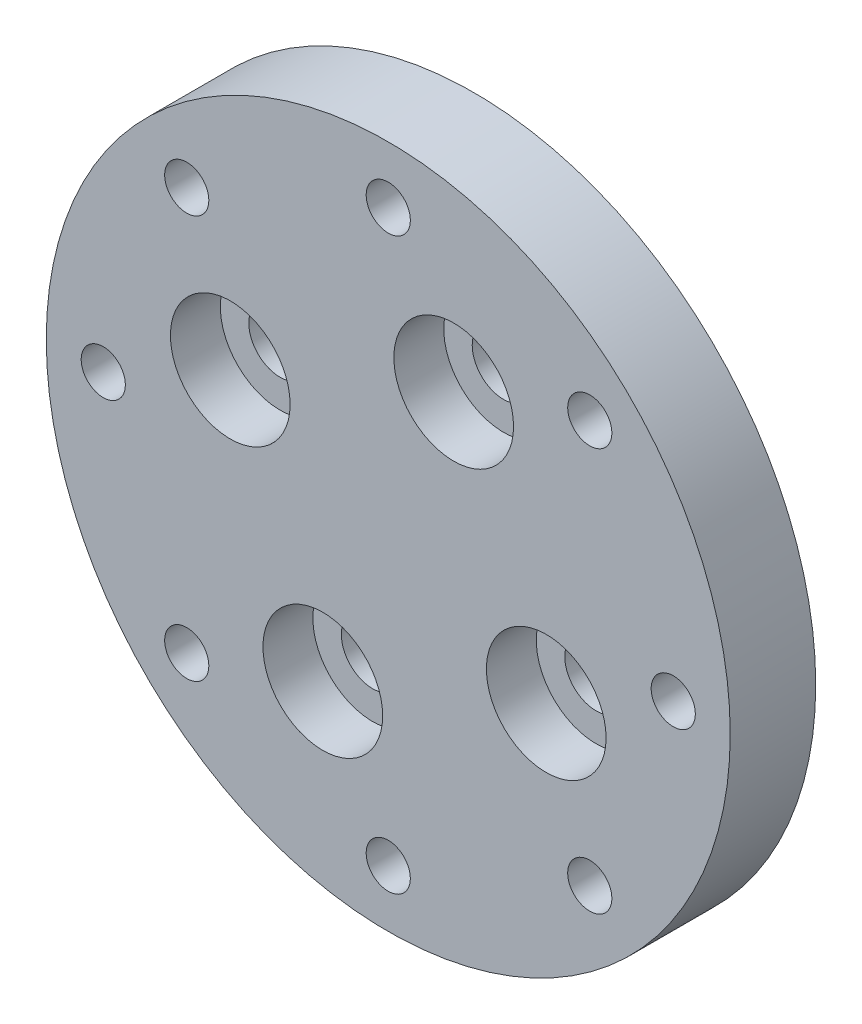
ISO-10303-21;
HEADER;
FILE_DESCRIPTION(('STEP AP214'),'2;1');
FILE_NAME('part.step','',(''),(''),'','','');
FILE_SCHEMA(('AUTOMOTIVE_DESIGN { 1 0 10303 214 1 1 1 1 }'));
ENDSEC;
DATA;
#1=APPLICATION_CONTEXT('core data for automotive mechanical design processes');
#2=APPLICATION_PROTOCOL_DEFINITION('international standard','automotive_design',2000,#1);
#3=PRODUCT_CONTEXT('',#1,'mechanical');
#4=PRODUCT('Part','Part','',(#3));
#5=PRODUCT_RELATED_PRODUCT_CATEGORY('part','',(#4));
#6=PRODUCT_DEFINITION_FORMATION('','',#4);
#7=PRODUCT_DEFINITION_CONTEXT('part definition',#1,'design');
#8=PRODUCT_DEFINITION('design','',#6,#7);
#9=PRODUCT_DEFINITION_SHAPE('','',#8);
#10=(LENGTH_UNIT() NAMED_UNIT(*) SI_UNIT(.MILLI.,.METRE.));
#11=(NAMED_UNIT(*) PLANE_ANGLE_UNIT() SI_UNIT($,.RADIAN.));
#12=(NAMED_UNIT(*) SI_UNIT($,.STERADIAN.) SOLID_ANGLE_UNIT());
#13=UNCERTAINTY_MEASURE_WITH_UNIT(LENGTH_MEASURE(1.E-05),#10,'distance_accuracy_value','');
#14=(GEOMETRIC_REPRESENTATION_CONTEXT(3) GLOBAL_UNCERTAINTY_ASSIGNED_CONTEXT((#13)) GLOBAL_UNIT_ASSIGNED_CONTEXT((#10,
#11,#12)) REPRESENTATION_CONTEXT('',''));
#15=CARTESIAN_POINT('',(0.,0.,0.));
#16=DIRECTION('',(0.,0.,1.));
#17=DIRECTION('',(1.,0.,0.));
#18=AXIS2_PLACEMENT_3D('',#15,#16,#17);
#19=CARTESIAN_POINT('',(0.,20.,12.2225396744427));
#20=DIRECTION('',(0.,0.,-1.));
#21=DIRECTION('',(-1.,0.,0.));
#22=AXIS2_PLACEMENT_3D('',#19,#20,#21);
#23=CYLINDRICAL_SURFACE('',#22,1.55);
#24=CARTESIAN_POINT('',(0.,20.,6.));
#25=DIRECTION('',(0.,0.,1.));
#26=DIRECTION('',(1.,0.,0.));
#27=AXIS2_PLACEMENT_3D('',#24,#25,#26);
#28=CIRCLE('',#27,1.55);
#29=CARTESIAN_POINT('',(1.55,20.,6.));
#30=VERTEX_POINT('',#29);
#31=EDGE_CURVE('E129',#30,#30,#28,.F.);
#32=ORIENTED_EDGE('',*,*,#31,.F.);
#33=EDGE_LOOP('',(#32));
#34=FACE_BOUND('',#33,.T.);
#35=CARTESIAN_POINT('',(0.,20.,3.));
#36=DIRECTION('',(0.,0.,-1.));
#37=DIRECTION('',(-1.,0.,0.));
#38=AXIS2_PLACEMENT_3D('',#35,#36,#37);
#39=CIRCLE('',#38,1.55);
#40=CARTESIAN_POINT('',(-1.55,20.,3.));
#41=VERTEX_POINT('',#40);
#42=EDGE_CURVE('E38',#41,#41,#39,.F.);
#43=ORIENTED_EDGE('',*,*,#42,.F.);
#44=EDGE_LOOP('',(#43));
#45=FACE_BOUND('',#44,.T.);
#46=ADVANCED_FACE('F34',(#34,#45),#23,.F.);
#47=CARTESIAN_POINT('',(-14.1421356237312,14.1421356237316,12.2225396744427));
#48=DIRECTION('',(0.,0.,-1.));
#49=DIRECTION('',(-1.,0.,0.));
#50=AXIS2_PLACEMENT_3D('',#47,#48,#49);
#51=CYLINDRICAL_SURFACE('',#50,1.5500000000001);
#52=CARTESIAN_POINT('',(-14.1421356237312,14.1421356237316,6.));
#53=DIRECTION('',(0.,0.,1.));
#54=DIRECTION('',(1.,0.,0.));
#55=AXIS2_PLACEMENT_3D('',#52,#53,#54);
#56=CIRCLE('',#55,1.5500000000001);
#57=CARTESIAN_POINT('',(-12.5921356237311,14.1421356237316,6.));
#58=VERTEX_POINT('',#57);
#59=EDGE_CURVE('E132',#58,#58,#56,.F.);
#60=ORIENTED_EDGE('',*,*,#59,.F.);
#61=EDGE_LOOP('',(#60));
#62=FACE_BOUND('',#61,.T.);
#63=CARTESIAN_POINT('',(-14.1421356237312,14.1421356237316,3.));
#64=DIRECTION('',(0.,0.,-1.));
#65=DIRECTION('',(-1.,0.,0.));
#66=AXIS2_PLACEMENT_3D('',#63,#64,#65);
#67=CIRCLE('',#66,1.5500000000001);
#68=CARTESIAN_POINT('',(-15.6921356237313,14.1421356237316,3.));
#69=VERTEX_POINT('',#68);
#70=EDGE_CURVE('E84',#69,#69,#67,.F.);
#71=ORIENTED_EDGE('',*,*,#70,.F.);
#72=EDGE_LOOP('',(#71));
#73=FACE_BOUND('',#72,.T.);
#74=ADVANCED_FACE('F170',(#62,#73),#51,.F.);
#75=CARTESIAN_POINT('',(-20.0000000000008,8.50201989313825E-13,12.2225396744427));
#76=DIRECTION('',(0.,0.,-1.));
#77=DIRECTION('',(-1.,0.,0.));
#78=AXIS2_PLACEMENT_3D('',#75,#76,#77);
#79=CYLINDRICAL_SURFACE('',#78,1.55000000000063);
#80=CARTESIAN_POINT('',(-20.0000000000008,8.50201989313825E-13,6.));
#81=DIRECTION('',(0.,0.,1.));
#82=DIRECTION('',(1.,0.,0.));
#83=AXIS2_PLACEMENT_3D('',#80,#81,#82);
#84=CIRCLE('',#83,1.55000000000063);
#85=CARTESIAN_POINT('',(-18.4500000000002,8.50201989313825E-13,6.));
#86=VERTEX_POINT('',#85);
#87=EDGE_CURVE('E135',#86,#86,#84,.F.);
#88=ORIENTED_EDGE('',*,*,#87,.F.);
#89=EDGE_LOOP('',(#88));
#90=FACE_BOUND('',#89,.T.);
#91=CARTESIAN_POINT('',(-20.0000000000008,8.50201989313825E-13,3.));
#92=DIRECTION('',(0.,0.,-1.));
#93=DIRECTION('',(-1.,0.,0.));
#94=AXIS2_PLACEMENT_3D('',#91,#92,#93);
#95=CIRCLE('',#94,1.55000000000063);
#96=CARTESIAN_POINT('',(-21.5500000000015,8.50201989313825E-13,3.));
#97=VERTEX_POINT('',#96);
#98=EDGE_CURVE('E82',#97,#97,#95,.F.);
#99=ORIENTED_EDGE('',*,*,#98,.F.);
#100=EDGE_LOOP('',(#99));
#101=FACE_BOUND('',#100,.T.);
#102=ADVANCED_FACE('F147',(#90,#101),#79,.F.);
#103=CARTESIAN_POINT('',(-14.1421356237324,-14.1421356237303,12.2225396744427));
#104=DIRECTION('',(0.,0.,-1.));
#105=DIRECTION('',(-1.,0.,0.));
#106=AXIS2_PLACEMENT_3D('',#103,#104,#105);
#107=CYLINDRICAL_SURFACE('',#106,1.55000000000131);
#108=CARTESIAN_POINT('',(-14.1421356237324,-14.1421356237303,6.));
#109=DIRECTION('',(0.,0.,1.));
#110=DIRECTION('',(1.,0.,0.));
#111=AXIS2_PLACEMENT_3D('',#108,#109,#110);
#112=CIRCLE('',#111,1.55000000000131);
#113=CARTESIAN_POINT('',(-12.5921356237311,-14.1421356237303,6.));
#114=VERTEX_POINT('',#113);
#115=EDGE_CURVE('E120',#114,#114,#112,.F.);
#116=ORIENTED_EDGE('',*,*,#115,.F.);
#117=EDGE_LOOP('',(#116));
#118=FACE_BOUND('',#117,.T.);
#119=CARTESIAN_POINT('',(-14.1421356237324,-14.1421356237303,3.));
#120=DIRECTION('',(0.,0.,-1.));
#121=DIRECTION('',(-1.,0.,0.));
#122=AXIS2_PLACEMENT_3D('',#119,#120,#121);
#123=CIRCLE('',#122,1.55000000000131);
#124=CARTESIAN_POINT('',(-15.6921356237337,-14.1421356237303,3.));
#125=VERTEX_POINT('',#124);
#126=EDGE_CURVE('E79',#125,#125,#123,.F.);
#127=ORIENTED_EDGE('',*,*,#126,.F.);
#128=EDGE_LOOP('',(#127));
#129=FACE_BOUND('',#128,.T.);
#130=ADVANCED_FACE('F143',(#118,#129),#107,.F.);
#131=CARTESIAN_POINT('',(-1.70040397862765E-12,-20.,12.2225396744427));
#132=DIRECTION('',(0.,0.,-1.));
#133=DIRECTION('',(-1.,0.,0.));
#134=AXIS2_PLACEMENT_3D('',#131,#132,#133);
#135=CYLINDRICAL_SURFACE('',#134,1.55000000000176);
#136=CARTESIAN_POINT('',(-1.70040397862765E-12,-20.,6.));
#137=DIRECTION('',(0.,0.,1.));
#138=DIRECTION('',(1.,0.,0.));
#139=AXIS2_PLACEMENT_3D('',#136,#137,#138);
#140=CIRCLE('',#139,1.55000000000176);
#141=CARTESIAN_POINT('',(1.55000000000006,-20.,6.));
#142=VERTEX_POINT('',#141);
#143=EDGE_CURVE('E117',#142,#142,#140,.F.);
#144=ORIENTED_EDGE('',*,*,#143,.F.);
#145=EDGE_LOOP('',(#144));
#146=FACE_BOUND('',#145,.T.);
#147=CARTESIAN_POINT('',(-1.70040397862765E-12,-20.,3.));
#148=DIRECTION('',(0.,0.,-1.));
#149=DIRECTION('',(-1.,0.,0.));
#150=AXIS2_PLACEMENT_3D('',#147,#148,#149);
#151=CIRCLE('',#150,1.55000000000176);
#152=CARTESIAN_POINT('',(-1.55000000000346,-20.,3.));
#153=VERTEX_POINT('',#152);
#154=EDGE_CURVE('E76',#153,#153,#151,.F.);
#155=ORIENTED_EDGE('',*,*,#154,.F.);
#156=EDGE_LOOP('',(#155));
#157=FACE_BOUND('',#156,.T.);
#158=ADVANCED_FACE('F146',(#146,#157),#135,.F.);
#159=CARTESIAN_POINT('',(14.1421356237295,-14.1421356237316,12.2225396744427));
#160=DIRECTION('',(0.,0.,-1.));
#161=DIRECTION('',(-1.,0.,0.));
#162=AXIS2_PLACEMENT_3D('',#159,#160,#161);
#163=CYLINDRICAL_SURFACE('',#162,1.55000000000173);
#164=CARTESIAN_POINT('',(14.1421356237295,-14.1421356237316,6.));
#165=DIRECTION('',(0.,0.,1.));
#166=DIRECTION('',(1.,0.,0.));
#167=AXIS2_PLACEMENT_3D('',#164,#165,#166);
#168=CIRCLE('',#167,1.55000000000173);
#169=CARTESIAN_POINT('',(15.6921356237312,-14.1421356237316,6.));
#170=VERTEX_POINT('',#169);
#171=EDGE_CURVE('E121',#170,#170,#168,.F.);
#172=ORIENTED_EDGE('',*,*,#171,.F.);
#173=EDGE_LOOP('',(#172));
#174=FACE_BOUND('',#173,.T.);
#175=CARTESIAN_POINT('',(14.1421356237295,-14.1421356237316,3.));
#176=DIRECTION('',(0.,0.,-1.));
#177=DIRECTION('',(-1.,0.,0.));
#178=AXIS2_PLACEMENT_3D('',#175,#176,#177);
#179=CIRCLE('',#178,1.55000000000173);
#180=CARTESIAN_POINT('',(12.5921356237278,-14.1421356237316,3.));
#181=VERTEX_POINT('',#180);
#182=EDGE_CURVE('E73',#181,#181,#179,.F.);
#183=ORIENTED_EDGE('',*,*,#182,.F.);
#184=EDGE_LOOP('',(#183));
#185=FACE_BOUND('',#184,.T.);
#186=ADVANCED_FACE('F271',(#174,#185),#163,.F.);
#187=CARTESIAN_POINT('',(19.9999999999992,-8.5265128291212E-13,12.2225396744427));
#188=DIRECTION('',(0.,0.,-1.));
#189=DIRECTION('',(-1.,0.,0.));
#190=AXIS2_PLACEMENT_3D('',#187,#188,#189);
#191=CYLINDRICAL_SURFACE('',#190,1.55000000000126);
#192=CARTESIAN_POINT('',(19.9999999999992,-8.5265128291212E-13,6.));
#193=DIRECTION('',(0.,0.,1.));
#194=DIRECTION('',(1.,0.,0.));
#195=AXIS2_PLACEMENT_3D('',#192,#193,#194);
#196=CIRCLE('',#195,1.55000000000126);
#197=CARTESIAN_POINT('',(21.5500000000004,-8.5265128291212E-13,6.));
#198=VERTEX_POINT('',#197);
#199=EDGE_CURVE('E124',#198,#198,#196,.F.);
#200=ORIENTED_EDGE('',*,*,#199,.F.);
#201=EDGE_LOOP('',(#200));
#202=FACE_BOUND('',#201,.T.);
#203=CARTESIAN_POINT('',(19.9999999999992,-8.5265128291212E-13,3.));
#204=DIRECTION('',(0.,0.,-1.));
#205=DIRECTION('',(-1.,0.,0.));
#206=AXIS2_PLACEMENT_3D('',#203,#204,#205);
#207=CIRCLE('',#206,1.55000000000126);
#208=CARTESIAN_POINT('',(18.4499999999979,-8.5265128291212E-13,3.));
#209=VERTEX_POINT('',#208);
#210=EDGE_CURVE('E69',#209,#209,#207,.F.);
#211=ORIENTED_EDGE('',*,*,#210,.F.);
#212=EDGE_LOOP('',(#211));
#213=FACE_BOUND('',#212,.T.);
#214=ADVANCED_FACE('F274',(#202,#213),#191,.F.);
#215=CARTESIAN_POINT('',(14.1421356237307,14.1421356237303,12.2225396744427));
#216=DIRECTION('',(0.,0.,-1.));
#217=DIRECTION('',(-1.,0.,0.));
#218=AXIS2_PLACEMENT_3D('',#215,#216,#217);
#219=CYLINDRICAL_SURFACE('',#218,1.55000000000065);
#220=CARTESIAN_POINT('',(14.1421356237307,14.1421356237303,6.));
#221=DIRECTION('',(0.,0.,1.));
#222=DIRECTION('',(1.,0.,0.));
#223=AXIS2_PLACEMENT_3D('',#220,#221,#222);
#224=CIRCLE('',#223,1.55000000000065);
#225=CARTESIAN_POINT('',(15.6921356237314,14.1421356237303,6.));
#226=VERTEX_POINT('',#225);
#227=EDGE_CURVE('E111',#226,#226,#224,.F.);
#228=ORIENTED_EDGE('',*,*,#227,.F.);
#229=EDGE_LOOP('',(#228));
#230=FACE_BOUND('',#229,.T.);
#231=CARTESIAN_POINT('',(14.1421356237307,14.1421356237303,3.));
#232=DIRECTION('',(0.,0.,-1.));
#233=DIRECTION('',(-1.,0.,0.));
#234=AXIS2_PLACEMENT_3D('',#231,#232,#233);
#235=CIRCLE('',#234,1.55000000000065);
#236=CARTESIAN_POINT('',(12.5921356237301,14.1421356237303,3.));
#237=VERTEX_POINT('',#236);
#238=EDGE_CURVE('E66',#237,#237,#235,.F.);
#239=ORIENTED_EDGE('',*,*,#238,.F.);
#240=EDGE_LOOP('',(#239));
#241=FACE_BOUND('',#240,.T.);
#242=ADVANCED_FACE('F181',(#230,#241),#219,.F.);
#243=CARTESIAN_POINT('',(-11.0865543901354,4.59220118838109,12.2225396744427));
#244=DIRECTION('',(0.,0.,-1.));
#245=DIRECTION('',(-1.,0.,0.));
#246=AXIS2_PLACEMENT_3D('',#243,#244,#245);
#247=CYLINDRICAL_SURFACE('',#246,2.2);
#248=CARTESIAN_POINT('',(-11.0865543901354,4.59220118838109,0.));
#249=DIRECTION('',(0.,0.,-1.));
#250=DIRECTION('',(-1.,0.,0.));
#251=AXIS2_PLACEMENT_3D('',#248,#249,#250);
#252=CIRCLE('',#251,2.2);
#253=CARTESIAN_POINT('',(-13.2865543901354,4.59220118838109,0.));
#254=VERTEX_POINT('',#253);
#255=EDGE_CURVE('E47',#254,#254,#252,.T.);
#256=ORIENTED_EDGE('',*,*,#255,.T.);
#257=EDGE_LOOP('',(#256));
#258=FACE_BOUND('',#257,.T.);
#259=CARTESIAN_POINT('',(-11.0865543901354,4.59220118838109,2.5));
#260=DIRECTION('',(0.,0.,1.));
#261=DIRECTION('',(1.,0.,0.));
#262=AXIS2_PLACEMENT_3D('',#259,#260,#261);
#263=CIRCLE('',#262,2.2);
#264=CARTESIAN_POINT('',(-8.88655439013544,4.59220118838109,2.5));
#265=VERTEX_POINT('',#264);
#266=EDGE_CURVE('E62',#265,#265,#263,.F.);
#267=ORIENTED_EDGE('',*,*,#266,.F.);
#268=EDGE_LOOP('',(#267));
#269=FACE_BOUND('',#268,.T.);
#270=ADVANCED_FACE('F187',(#258,#269),#247,.F.);
#271=CARTESIAN_POINT('',(4.59220118838127,11.086554390135,12.2225396744427));
#272=DIRECTION('',(0.,0.,-1.));
#273=DIRECTION('',(-1.,0.,0.));
#274=AXIS2_PLACEMENT_3D('',#271,#272,#273);
#275=CYLINDRICAL_SURFACE('',#274,2.20000000000037);
#276=CARTESIAN_POINT('',(4.59220118838127,11.086554390135,0.));
#277=DIRECTION('',(0.,0.,-1.));
#278=DIRECTION('',(-1.,0.,0.));
#279=AXIS2_PLACEMENT_3D('',#276,#277,#278);
#280=CIRCLE('',#279,2.20000000000037);
#281=CARTESIAN_POINT('',(2.39220118838089,11.086554390135,0.));
#282=VERTEX_POINT('',#281);
#283=EDGE_CURVE('E65',#282,#282,#280,.T.);
#284=ORIENTED_EDGE('',*,*,#283,.T.);
#285=EDGE_LOOP('',(#284));
#286=FACE_BOUND('',#285,.T.);
#287=CARTESIAN_POINT('',(4.59220118838127,11.086554390135,2.5));
#288=DIRECTION('',(0.,0.,1.));
#289=DIRECTION('',(1.,0.,0.));
#290=AXIS2_PLACEMENT_3D('',#287,#288,#289);
#291=CIRCLE('',#290,2.20000000000037);
#292=CARTESIAN_POINT('',(6.79220118838164,11.086554390135,2.5));
#293=VERTEX_POINT('',#292);
#294=EDGE_CURVE('E59',#293,#293,#291,.F.);
#295=ORIENTED_EDGE('',*,*,#294,.F.);
#296=EDGE_LOOP('',(#295));
#297=FACE_BOUND('',#296,.T.);
#298=ADVANCED_FACE('F190',(#286,#297),#275,.F.);
#299=CARTESIAN_POINT('',(11.0865543901352,-4.5922011883817,12.2225396744427));
#300=DIRECTION('',(0.,0.,-1.));
#301=DIRECTION('',(-1.,0.,0.));
#302=AXIS2_PLACEMENT_3D('',#299,#300,#301);
#303=CYLINDRICAL_SURFACE('',#302,2.20000000000007);
#304=CARTESIAN_POINT('',(11.0865543901352,-4.5922011883817,0.));
#305=DIRECTION('',(0.,0.,-1.));
#306=DIRECTION('',(-1.,0.,0.));
#307=AXIS2_PLACEMENT_3D('',#304,#305,#306);
#308=CIRCLE('',#307,2.20000000000007);
#309=CARTESIAN_POINT('',(8.88655439013512,-4.5922011883817,0.));
#310=VERTEX_POINT('',#309);
#311=EDGE_CURVE('E112',#310,#310,#308,.T.);
#312=ORIENTED_EDGE('',*,*,#311,.T.);
#313=EDGE_LOOP('',(#312));
#314=FACE_BOUND('',#313,.T.);
#315=CARTESIAN_POINT('',(11.0865543901352,-4.5922011883817,2.5));
#316=DIRECTION('',(0.,0.,1.));
#317=DIRECTION('',(1.,0.,0.));
#318=AXIS2_PLACEMENT_3D('',#315,#316,#317);
#319=CIRCLE('',#318,2.20000000000007);
#320=CARTESIAN_POINT('',(13.2865543901353,-4.5922011883817,2.5));
#321=VERTEX_POINT('',#320);
#322=EDGE_CURVE('E55',#321,#321,#319,.F.);
#323=ORIENTED_EDGE('',*,*,#322,.F.);
#324=EDGE_LOOP('',(#323));
#325=FACE_BOUND('',#324,.T.);
#326=ADVANCED_FACE('F253',(#314,#325),#303,.F.);
#327=CARTESIAN_POINT('',(-4.59220118838152,-11.0865543901356,12.2225396744427));
#328=DIRECTION('',(0.,0.,-1.));
#329=DIRECTION('',(-1.,0.,0.));
#330=AXIS2_PLACEMENT_3D('',#327,#328,#329);
#331=CYLINDRICAL_SURFACE('',#330,2.19999999999971);
#332=CARTESIAN_POINT('',(-4.59220118838152,-11.0865543901356,0.));
#333=DIRECTION('',(0.,0.,-1.));
#334=DIRECTION('',(-1.,0.,0.));
#335=AXIS2_PLACEMENT_3D('',#332,#333,#334);
#336=CIRCLE('',#335,2.19999999999971);
#337=CARTESIAN_POINT('',(-6.79220118838123,-11.0865543901356,0.));
#338=VERTEX_POINT('',#337);
#339=EDGE_CURVE('E108',#338,#338,#336,.T.);
#340=ORIENTED_EDGE('',*,*,#339,.T.);
#341=EDGE_LOOP('',(#340));
#342=FACE_BOUND('',#341,.T.);
#343=CARTESIAN_POINT('',(-4.59220118838152,-11.0865543901356,2.5));
#344=DIRECTION('',(0.,0.,1.));
#345=DIRECTION('',(1.,0.,0.));
#346=AXIS2_PLACEMENT_3D('',#343,#344,#345);
#347=CIRCLE('',#346,2.19999999999971);
#348=CARTESIAN_POINT('',(-2.39220118838181,-11.0865543901356,2.5));
#349=VERTEX_POINT('',#348);
#350=EDGE_CURVE('E52',#349,#349,#347,.F.);
#351=ORIENTED_EDGE('',*,*,#350,.F.);
#352=EDGE_LOOP('',(#351));
#353=FACE_BOUND('',#352,.T.);
#354=ADVANCED_FACE('F248',(#342,#353),#331,.F.);
#355=CARTESIAN_POINT('',(0.,0.,6.));
#356=DIRECTION('',(0.,0.,-1.));
#357=DIRECTION('',(-1.,0.,0.));
#358=AXIS2_PLACEMENT_3D('',#355,#356,#357);
#359=CYLINDRICAL_SURFACE('',#358,24.);
#360=CARTESIAN_POINT('',(0.,0.,6.));
#361=DIRECTION('',(0.,0.,1.));
#362=DIRECTION('',(1.,0.,0.));
#363=AXIS2_PLACEMENT_3D('',#360,#361,#362);
#364=CIRCLE('',#363,24.);
#365=CARTESIAN_POINT('',(24.,0.,6.));
#366=VERTEX_POINT('',#365);
#367=EDGE_CURVE('E10',#366,#366,#364,.T.);
#368=ORIENTED_EDGE('',*,*,#367,.F.);
#369=EDGE_LOOP('',(#368));
#370=FACE_BOUND('',#369,.T.);
#371=CARTESIAN_POINT('',(0.,0.,0.));
#372=DIRECTION('',(0.,0.,1.));
#373=DIRECTION('',(1.,0.,0.));
#374=AXIS2_PLACEMENT_3D('',#371,#372,#373);
#375=CIRCLE('',#374,24.);
#376=CARTESIAN_POINT('',(24.,0.,0.));
#377=VERTEX_POINT('',#376);
#378=EDGE_CURVE('E42',#377,#377,#375,.T.);
#379=ORIENTED_EDGE('',*,*,#378,.T.);
#380=EDGE_LOOP('',(#379));
#381=FACE_BOUND('',#380,.T.);
#382=ADVANCED_FACE('F36',(#370,#381),#359,.T.);
#383=CARTESIAN_POINT('',(0.,0.,6.));
#384=DIRECTION('',(0.,0.,1.));
#385=DIRECTION('',(1.,0.,0.));
#386=AXIS2_PLACEMENT_3D('',#383,#384,#385);
#387=PLANE('',#386);
#388=CARTESIAN_POINT('',(-4.59220118838064,-11.0865543901353,6.));
#389=DIRECTION('',(0.,0.,1.));
#390=DIRECTION('',(1.,0.,0.));
#391=AXIS2_PLACEMENT_3D('',#388,#389,#390);
#392=CIRCLE('',#391,4.20000000000004);
#393=CARTESIAN_POINT('',(-0.3922011883806,-11.0865543901353,6.));
#394=VERTEX_POINT('',#393);
#395=EDGE_CURVE('E89',#394,#394,#392,.T.);
#396=ORIENTED_EDGE('',*,*,#395,.F.);
#397=EDGE_LOOP('',(#396));
#398=FACE_BOUND('',#397,.T.);
#399=CARTESIAN_POINT('',(11.0865543901357,-4.59220118838045,6.));
#400=DIRECTION('',(0.,0.,1.));
#401=DIRECTION('',(1.,0.,0.));
#402=AXIS2_PLACEMENT_3D('',#399,#400,#401);
#403=CIRCLE('',#402,4.20000000000049);
#404=CARTESIAN_POINT('',(15.2865543901362,-4.59220118838045,6.));
#405=VERTEX_POINT('',#404);
#406=EDGE_CURVE('E98',#405,#405,#403,.T.);
#407=ORIENTED_EDGE('',*,*,#406,.F.);
#408=EDGE_LOOP('',(#407));
#409=FACE_BOUND('',#408,.T.);
#410=CARTESIAN_POINT('',(4.5922011883809,11.0865543901359,6.));
#411=DIRECTION('',(0.,0.,1.));
#412=DIRECTION('',(1.,0.,0.));
#413=AXIS2_PLACEMENT_3D('',#410,#411,#412);
#414=CIRCLE('',#413,4.20000000000051);
#415=CARTESIAN_POINT('',(8.79220118838141,11.0865543901359,6.));
#416=VERTEX_POINT('',#415);
#417=EDGE_CURVE('E398',#416,#416,#414,.T.);
#418=ORIENTED_EDGE('',*,*,#417,.F.);
#419=EDGE_LOOP('',(#418));
#420=FACE_BOUND('',#419,.T.);
#421=CARTESIAN_POINT('',(-11.0865543901354,4.59220118838109,6.));
#422=DIRECTION('',(0.,0.,1.));
#423=DIRECTION('',(1.,0.,0.));
#424=AXIS2_PLACEMENT_3D('',#421,#422,#423);
#425=CIRCLE('',#424,4.2);
#426=CARTESIAN_POINT('',(-6.88655439013544,4.59220118838109,6.));
#427=VERTEX_POINT('',#426);
#428=EDGE_CURVE('E104',#427,#427,#425,.T.);
#429=ORIENTED_EDGE('',*,*,#428,.F.);
#430=EDGE_LOOP('',(#429));
#431=FACE_BOUND('',#430,.T.);
#432=ORIENTED_EDGE('',*,*,#227,.T.);
#433=EDGE_LOOP('',(#432));
#434=FACE_BOUND('',#433,.T.);
#435=ORIENTED_EDGE('',*,*,#199,.T.);
#436=EDGE_LOOP('',(#435));
#437=FACE_BOUND('',#436,.T.);
#438=ORIENTED_EDGE('',*,*,#171,.T.);
#439=EDGE_LOOP('',(#438));
#440=FACE_BOUND('',#439,.T.);
#441=ORIENTED_EDGE('',*,*,#143,.T.);
#442=EDGE_LOOP('',(#441));
#443=FACE_BOUND('',#442,.T.);
#444=ORIENTED_EDGE('',*,*,#115,.T.);
#445=EDGE_LOOP('',(#444));
#446=FACE_BOUND('',#445,.T.);
#447=ORIENTED_EDGE('',*,*,#87,.T.);
#448=EDGE_LOOP('',(#447));
#449=FACE_BOUND('',#448,.T.);
#450=ORIENTED_EDGE('',*,*,#59,.T.);
#451=EDGE_LOOP('',(#450));
#452=FACE_BOUND('',#451,.T.);
#453=ORIENTED_EDGE('',*,*,#31,.T.);
#454=EDGE_LOOP('',(#453));
#455=FACE_BOUND('',#454,.T.);
#456=ORIENTED_EDGE('',*,*,#367,.T.);
#457=EDGE_LOOP('',(#456));
#458=FACE_BOUND('',#457,.T.);
#459=ADVANCED_FACE('F140',(#398,#409,#420,#431,#434,#437,#440,#443,#446,#449,#452,#455,#458),
#387,.T.);
#460=CARTESIAN_POINT('',(0.,0.,0.));
#461=DIRECTION('',(0.,0.,1.));
#462=DIRECTION('',(1.,0.,0.));
#463=AXIS2_PLACEMENT_3D('',#460,#461,#462);
#464=PLANE('',#463);
#465=CARTESIAN_POINT('',(14.1421356237307,14.1421356237303,0.));
#466=DIRECTION('',(0.,0.,-1.));
#467=DIRECTION('',(-1.,0.,0.));
#468=AXIS2_PLACEMENT_3D('',#465,#466,#467);
#469=CIRCLE('',#468,3.50000000000065);
#470=CARTESIAN_POINT('',(10.6421356237301,14.1421356237303,0.));
#471=VERTEX_POINT('',#470);
#472=EDGE_CURVE('E207',#471,#471,#469,.T.);
#473=ORIENTED_EDGE('',*,*,#472,.F.);
#474=EDGE_LOOP('',(#473));
#475=FACE_BOUND('',#474,.T.);
#476=CARTESIAN_POINT('',(19.9999999999992,-8.5265128291212E-13,0.));
#477=DIRECTION('',(0.,0.,-1.));
#478=DIRECTION('',(-1.,0.,0.));
#479=AXIS2_PLACEMENT_3D('',#476,#477,#478);
#480=CIRCLE('',#479,3.50000000000126);
#481=CARTESIAN_POINT('',(16.4999999999979,-8.5265128291212E-13,0.));
#482=VERTEX_POINT('',#481);
#483=EDGE_CURVE('E211',#482,#482,#480,.T.);
#484=ORIENTED_EDGE('',*,*,#483,.F.);
#485=EDGE_LOOP('',(#484));
#486=FACE_BOUND('',#485,.T.);
#487=CARTESIAN_POINT('',(14.1421356237295,-14.1421356237316,0.));
#488=DIRECTION('',(0.,0.,-1.));
#489=DIRECTION('',(-1.,0.,0.));
#490=AXIS2_PLACEMENT_3D('',#487,#488,#489);
#491=CIRCLE('',#490,3.50000000000173);
#492=CARTESIAN_POINT('',(10.6421356237278,-14.1421356237316,0.));
#493=VERTEX_POINT('',#492);
#494=EDGE_CURVE('E215',#493,#493,#491,.T.);
#495=ORIENTED_EDGE('',*,*,#494,.F.);
#496=EDGE_LOOP('',(#495));
#497=FACE_BOUND('',#496,.T.);
#498=CARTESIAN_POINT('',(-1.70040397862765E-12,-20.,0.));
#499=DIRECTION('',(0.,0.,-1.));
#500=DIRECTION('',(-1.,0.,0.));
#501=AXIS2_PLACEMENT_3D('',#498,#499,#500);
#502=CIRCLE('',#501,3.50000000000176);
#503=CARTESIAN_POINT('',(-3.50000000000346,-20.,0.));
#504=VERTEX_POINT('',#503);
#505=EDGE_CURVE('E219',#504,#504,#502,.T.);
#506=ORIENTED_EDGE('',*,*,#505,.F.);
#507=EDGE_LOOP('',(#506));
#508=FACE_BOUND('',#507,.T.);
#509=CARTESIAN_POINT('',(-14.1421356237324,-14.1421356237303,0.));
#510=DIRECTION('',(0.,0.,-1.));
#511=DIRECTION('',(-1.,0.,0.));
#512=AXIS2_PLACEMENT_3D('',#509,#510,#511);
#513=CIRCLE('',#512,3.50000000000131);
#514=CARTESIAN_POINT('',(-17.6421356237337,-14.1421356237303,0.));
#515=VERTEX_POINT('',#514);
#516=EDGE_CURVE('E223',#515,#515,#513,.T.);
#517=ORIENTED_EDGE('',*,*,#516,.F.);
#518=EDGE_LOOP('',(#517));
#519=FACE_BOUND('',#518,.T.);
#520=CARTESIAN_POINT('',(-20.0000000000008,8.50201989313825E-13,0.));
#521=DIRECTION('',(0.,0.,-1.));
#522=DIRECTION('',(-1.,0.,0.));
#523=AXIS2_PLACEMENT_3D('',#520,#521,#522);
#524=CIRCLE('',#523,3.50000000000063);
#525=CARTESIAN_POINT('',(-23.5000000000015,8.50201989313825E-13,0.));
#526=VERTEX_POINT('',#525);
#527=EDGE_CURVE('E227',#526,#526,#524,.T.);
#528=ORIENTED_EDGE('',*,*,#527,.F.);
#529=EDGE_LOOP('',(#528));
#530=FACE_BOUND('',#529,.T.);
#531=CARTESIAN_POINT('',(-14.1421356237312,14.1421356237316,0.));
#532=DIRECTION('',(0.,0.,-1.));
#533=DIRECTION('',(-1.,0.,0.));
#534=AXIS2_PLACEMENT_3D('',#531,#532,#533);
#535=CIRCLE('',#534,3.5000000000001);
#536=CARTESIAN_POINT('',(-17.6421356237313,14.1421356237316,0.));
#537=VERTEX_POINT('',#536);
#538=EDGE_CURVE('E231',#537,#537,#535,.T.);
#539=ORIENTED_EDGE('',*,*,#538,.F.);
#540=EDGE_LOOP('',(#539));
#541=FACE_BOUND('',#540,.T.);
#542=CARTESIAN_POINT('',(0.,20.,0.));
#543=DIRECTION('',(0.,0.,-1.));
#544=DIRECTION('',(-1.,0.,0.));
#545=AXIS2_PLACEMENT_3D('',#542,#543,#544);
#546=CIRCLE('',#545,3.5);
#547=CARTESIAN_POINT('',(-3.5,20.,0.));
#548=VERTEX_POINT('',#547);
#549=EDGE_CURVE('E235',#548,#548,#546,.T.);
#550=ORIENTED_EDGE('',*,*,#549,.F.);
#551=EDGE_LOOP('',(#550));
#552=FACE_BOUND('',#551,.T.);
#553=ORIENTED_EDGE('',*,*,#339,.F.);
#554=EDGE_LOOP('',(#553));
#555=FACE_BOUND('',#554,.T.);
#556=ORIENTED_EDGE('',*,*,#311,.F.);
#557=EDGE_LOOP('',(#556));
#558=FACE_BOUND('',#557,.T.);
#559=ORIENTED_EDGE('',*,*,#283,.F.);
#560=EDGE_LOOP('',(#559));
#561=FACE_BOUND('',#560,.T.);
#562=ORIENTED_EDGE('',*,*,#255,.F.);
#563=EDGE_LOOP('',(#562));
#564=FACE_BOUND('',#563,.T.);
#565=ORIENTED_EDGE('',*,*,#378,.F.);
#566=EDGE_LOOP('',(#565));
#567=FACE_BOUND('',#566,.T.);
#568=ADVANCED_FACE('F193',(#475,#486,#497,#508,#519,#530,#541,#552,#555,#558,#561,#564,#567),
#464,.F.);
#569=CARTESIAN_POINT('',(-4.59220118838064,-11.0865543901353,2.5));
#570=DIRECTION('',(0.,0.,1.));
#571=DIRECTION('',(1.,0.,0.));
#572=AXIS2_PLACEMENT_3D('',#569,#570,#571);
#573=PLANE('',#572);
#574=CARTESIAN_POINT('',(-4.59220118838064,-11.0865543901353,2.5));
#575=DIRECTION('',(0.,0.,1.));
#576=DIRECTION('',(1.,0.,0.));
#577=AXIS2_PLACEMENT_3D('',#574,#575,#576);
#578=CIRCLE('',#577,4.20000000000004);
#579=CARTESIAN_POINT('',(-0.3922011883806,-11.0865543901353,2.5));
#580=VERTEX_POINT('',#579);
#581=EDGE_CURVE('E93',#580,#580,#578,.T.);
#582=ORIENTED_EDGE('',*,*,#581,.T.);
#583=EDGE_LOOP('',(#582));
#584=FACE_BOUND('',#583,.T.);
#585=ORIENTED_EDGE('',*,*,#350,.T.);
#586=EDGE_LOOP('',(#585));
#587=FACE_BOUND('',#586,.T.);
#588=ADVANCED_FACE('F196',(#584,#587),#573,.T.);
#589=CARTESIAN_POINT('',(-4.59220118838064,-11.0865543901353,2.5));
#590=DIRECTION('',(0.,0.,1.));
#591=DIRECTION('',(1.,0.,0.));
#592=AXIS2_PLACEMENT_3D('',#589,#590,#591);
#593=CYLINDRICAL_SURFACE('',#592,4.20000000000004);
#594=ORIENTED_EDGE('',*,*,#581,.F.);
#595=EDGE_LOOP('',(#594));
#596=FACE_BOUND('',#595,.T.);
#597=ORIENTED_EDGE('',*,*,#395,.T.);
#598=EDGE_LOOP('',(#597));
#599=FACE_BOUND('',#598,.T.);
#600=ADVANCED_FACE('F201',(#596,#599),#593,.F.);
#601=CARTESIAN_POINT('',(11.0865543901357,-4.59220118838045,2.5));
#602=DIRECTION('',(0.,0.,1.));
#603=DIRECTION('',(1.,0.,0.));
#604=AXIS2_PLACEMENT_3D('',#601,#602,#603);
#605=PLANE('',#604);
#606=CARTESIAN_POINT('',(11.0865543901357,-4.59220118838045,2.5));
#607=DIRECTION('',(0.,0.,1.));
#608=DIRECTION('',(1.,0.,0.));
#609=AXIS2_PLACEMENT_3D('',#606,#607,#608);
#610=CIRCLE('',#609,4.20000000000049);
#611=CARTESIAN_POINT('',(15.2865543901362,-4.59220118838045,2.5));
#612=VERTEX_POINT('',#611);
#613=EDGE_CURVE('E401',#612,#612,#610,.T.);
#614=ORIENTED_EDGE('',*,*,#613,.T.);
#615=EDGE_LOOP('',(#614));
#616=FACE_BOUND('',#615,.T.);
#617=ORIENTED_EDGE('',*,*,#322,.T.);
#618=EDGE_LOOP('',(#617));
#619=FACE_BOUND('',#618,.T.);
#620=ADVANCED_FACE('F329',(#616,#619),#605,.T.);
#621=CARTESIAN_POINT('',(11.0865543901357,-4.59220118838045,2.5));
#622=DIRECTION('',(0.,0.,1.));
#623=DIRECTION('',(1.,0.,0.));
#624=AXIS2_PLACEMENT_3D('',#621,#622,#623);
#625=CYLINDRICAL_SURFACE('',#624,4.20000000000049);
#626=ORIENTED_EDGE('',*,*,#613,.F.);
#627=EDGE_LOOP('',(#626));
#628=FACE_BOUND('',#627,.T.);
#629=ORIENTED_EDGE('',*,*,#406,.T.);
#630=EDGE_LOOP('',(#629));
#631=FACE_BOUND('',#630,.T.);
#632=ADVANCED_FACE('F323',(#628,#631),#625,.F.);
#633=CARTESIAN_POINT('',(4.5922011883809,11.0865543901359,2.5));
#634=DIRECTION('',(0.,0.,1.));
#635=DIRECTION('',(1.,0.,0.));
#636=AXIS2_PLACEMENT_3D('',#633,#634,#635);
#637=PLANE('',#636);
#638=CARTESIAN_POINT('',(4.5922011883809,11.0865543901359,2.5));
#639=DIRECTION('',(0.,0.,1.));
#640=DIRECTION('',(1.,0.,0.));
#641=AXIS2_PLACEMENT_3D('',#638,#639,#640);
#642=CIRCLE('',#641,4.20000000000051);
#643=CARTESIAN_POINT('',(8.79220118838141,11.0865543901359,2.5));
#644=VERTEX_POINT('',#643);
#645=EDGE_CURVE('E107',#644,#644,#642,.T.);
#646=ORIENTED_EDGE('',*,*,#645,.T.);
#647=EDGE_LOOP('',(#646));
#648=FACE_BOUND('',#647,.T.);
#649=ORIENTED_EDGE('',*,*,#294,.T.);
#650=EDGE_LOOP('',(#649));
#651=FACE_BOUND('',#650,.T.);
#652=ADVANCED_FACE('F319',(#648,#651),#637,.T.);
#653=CARTESIAN_POINT('',(4.5922011883809,11.0865543901359,2.5));
#654=DIRECTION('',(0.,0.,1.));
#655=DIRECTION('',(1.,0.,0.));
#656=AXIS2_PLACEMENT_3D('',#653,#654,#655);
#657=CYLINDRICAL_SURFACE('',#656,4.20000000000051);
#658=ORIENTED_EDGE('',*,*,#645,.F.);
#659=EDGE_LOOP('',(#658));
#660=FACE_BOUND('',#659,.T.);
#661=ORIENTED_EDGE('',*,*,#417,.T.);
#662=EDGE_LOOP('',(#661));
#663=FACE_BOUND('',#662,.T.);
#664=ADVANCED_FACE('F322',(#660,#663),#657,.F.);
#665=CARTESIAN_POINT('',(-11.0865543901354,4.59220118838109,2.5));
#666=DIRECTION('',(0.,0.,1.));
#667=DIRECTION('',(1.,0.,0.));
#668=AXIS2_PLACEMENT_3D('',#665,#666,#667);
#669=PLANE('',#668);
#670=CARTESIAN_POINT('',(-11.0865543901354,4.59220118838109,2.5));
#671=DIRECTION('',(0.,0.,1.));
#672=DIRECTION('',(1.,0.,0.));
#673=AXIS2_PLACEMENT_3D('',#670,#671,#672);
#674=CIRCLE('',#673,4.2);
#675=CARTESIAN_POINT('',(-6.88655439013544,4.59220118838109,2.5));
#676=VERTEX_POINT('',#675);
#677=EDGE_CURVE('E56',#676,#676,#674,.T.);
#678=ORIENTED_EDGE('',*,*,#677,.T.);
#679=EDGE_LOOP('',(#678));
#680=FACE_BOUND('',#679,.T.);
#681=ORIENTED_EDGE('',*,*,#266,.T.);
#682=EDGE_LOOP('',(#681));
#683=FACE_BOUND('',#682,.T.);
#684=ADVANCED_FACE('F327',(#680,#683),#669,.T.);
#685=CARTESIAN_POINT('',(-11.0865543901354,4.59220118838109,2.5));
#686=DIRECTION('',(0.,0.,1.));
#687=DIRECTION('',(1.,0.,0.));
#688=AXIS2_PLACEMENT_3D('',#685,#686,#687);
#689=CYLINDRICAL_SURFACE('',#688,4.2);
#690=ORIENTED_EDGE('',*,*,#677,.F.);
#691=EDGE_LOOP('',(#690));
#692=FACE_BOUND('',#691,.T.);
#693=ORIENTED_EDGE('',*,*,#428,.T.);
#694=EDGE_LOOP('',(#693));
#695=FACE_BOUND('',#694,.T.);
#696=ADVANCED_FACE('F263',(#692,#695),#689,.F.);
#697=CARTESIAN_POINT('',(14.1421356237307,14.1421356237303,3.));
#698=DIRECTION('',(0.,0.,-1.));
#699=DIRECTION('',(-1.,0.,0.));
#700=AXIS2_PLACEMENT_3D('',#697,#698,#699);
#701=PLANE('',#700);
#702=CARTESIAN_POINT('',(14.1421356237307,14.1421356237303,3.));
#703=DIRECTION('',(0.,0.,-1.));
#704=DIRECTION('',(-1.,0.,0.));
#705=AXIS2_PLACEMENT_3D('',#702,#703,#704);
#706=CIRCLE('',#705,3.50000000000065);
#707=CARTESIAN_POINT('',(10.6421356237301,14.1421356237303,3.));
#708=VERTEX_POINT('',#707);
#709=EDGE_CURVE('E388',#708,#708,#706,.T.);
#710=ORIENTED_EDGE('',*,*,#709,.T.);
#711=EDGE_LOOP('',(#710));
#712=FACE_BOUND('',#711,.T.);
#713=ORIENTED_EDGE('',*,*,#238,.T.);
#714=EDGE_LOOP('',(#713));
#715=FACE_BOUND('',#714,.T.);
#716=ADVANCED_FACE('F299',(#712,#715),#701,.T.);
#717=CARTESIAN_POINT('',(14.1421356237307,14.1421356237303,3.));
#718=DIRECTION('',(0.,0.,-1.));
#719=DIRECTION('',(-1.,0.,0.));
#720=AXIS2_PLACEMENT_3D('',#717,#718,#719);
#721=CYLINDRICAL_SURFACE('',#720,3.50000000000065);
#722=ORIENTED_EDGE('',*,*,#709,.F.);
#723=EDGE_LOOP('',(#722));
#724=FACE_BOUND('',#723,.T.);
#725=ORIENTED_EDGE('',*,*,#472,.T.);
#726=EDGE_LOOP('',(#725));
#727=FACE_BOUND('',#726,.T.);
#728=ADVANCED_FACE('F289',(#724,#727),#721,.F.);
#729=CARTESIAN_POINT('',(19.9999999999992,-8.5265128291212E-13,3.));
#730=DIRECTION('',(0.,0.,-1.));
#731=DIRECTION('',(-1.,0.,0.));
#732=AXIS2_PLACEMENT_3D('',#729,#730,#731);
#733=PLANE('',#732);
#734=CARTESIAN_POINT('',(19.9999999999992,-8.5265128291212E-13,3.));
#735=DIRECTION('',(0.,0.,-1.));
#736=DIRECTION('',(-1.,0.,0.));
#737=AXIS2_PLACEMENT_3D('',#734,#735,#736);
#738=CIRCLE('',#737,3.50000000000126);
#739=CARTESIAN_POINT('',(16.4999999999979,-8.5265128291212E-13,3.));
#740=VERTEX_POINT('',#739);
#741=EDGE_CURVE('E382',#740,#740,#738,.T.);
#742=ORIENTED_EDGE('',*,*,#741,.T.);
#743=EDGE_LOOP('',(#742));
#744=FACE_BOUND('',#743,.T.);
#745=ORIENTED_EDGE('',*,*,#210,.T.);
#746=EDGE_LOOP('',(#745));
#747=FACE_BOUND('',#746,.T.);
#748=ADVANCED_FACE('F286',(#744,#747),#733,.T.);
#749=CARTESIAN_POINT('',(19.9999999999992,-8.5265128291212E-13,3.));
#750=DIRECTION('',(0.,0.,-1.));
#751=DIRECTION('',(-1.,0.,0.));
#752=AXIS2_PLACEMENT_3D('',#749,#750,#751);
#753=CYLINDRICAL_SURFACE('',#752,3.50000000000126);
#754=ORIENTED_EDGE('',*,*,#741,.F.);
#755=EDGE_LOOP('',(#754));
#756=FACE_BOUND('',#755,.T.);
#757=ORIENTED_EDGE('',*,*,#483,.T.);
#758=EDGE_LOOP('',(#757));
#759=FACE_BOUND('',#758,.T.);
#760=ADVANCED_FACE('F288',(#756,#759),#753,.F.);
#761=CARTESIAN_POINT('',(14.1421356237295,-14.1421356237316,3.));
#762=DIRECTION('',(0.,0.,-1.));
#763=DIRECTION('',(-1.,0.,0.));
#764=AXIS2_PLACEMENT_3D('',#761,#762,#763);
#765=PLANE('',#764);
#766=CARTESIAN_POINT('',(14.1421356237295,-14.1421356237316,3.));
#767=DIRECTION('',(0.,0.,-1.));
#768=DIRECTION('',(-1.,0.,0.));
#769=AXIS2_PLACEMENT_3D('',#766,#767,#768);
#770=CIRCLE('',#769,3.50000000000173);
#771=CARTESIAN_POINT('',(10.6421356237278,-14.1421356237316,3.));
#772=VERTEX_POINT('',#771);
#773=EDGE_CURVE('E376',#772,#772,#770,.T.);
#774=ORIENTED_EDGE('',*,*,#773,.T.);
#775=EDGE_LOOP('',(#774));
#776=FACE_BOUND('',#775,.T.);
#777=ORIENTED_EDGE('',*,*,#182,.T.);
#778=EDGE_LOOP('',(#777));
#779=FACE_BOUND('',#778,.T.);
#780=ADVANCED_FACE('F296',(#776,#779),#765,.T.);
#781=CARTESIAN_POINT('',(14.1421356237295,-14.1421356237316,3.));
#782=DIRECTION('',(0.,0.,-1.));
#783=DIRECTION('',(-1.,0.,0.));
#784=AXIS2_PLACEMENT_3D('',#781,#782,#783);
#785=CYLINDRICAL_SURFACE('',#784,3.50000000000173);
#786=ORIENTED_EDGE('',*,*,#773,.F.);
#787=EDGE_LOOP('',(#786));
#788=FACE_BOUND('',#787,.T.);
#789=ORIENTED_EDGE('',*,*,#494,.T.);
#790=EDGE_LOOP('',(#789));
#791=FACE_BOUND('',#790,.T.);
#792=ADVANCED_FACE('F304',(#788,#791),#785,.F.);
#793=CARTESIAN_POINT('',(-1.70040397862765E-12,-20.,3.));
#794=DIRECTION('',(0.,0.,-1.));
#795=DIRECTION('',(-1.,0.,0.));
#796=AXIS2_PLACEMENT_3D('',#793,#794,#795);
#797=PLANE('',#796);
#798=CARTESIAN_POINT('',(-1.70040397862765E-12,-20.,3.));
#799=DIRECTION('',(0.,0.,-1.));
#800=DIRECTION('',(-1.,0.,0.));
#801=AXIS2_PLACEMENT_3D('',#798,#799,#800);
#802=CIRCLE('',#801,3.50000000000176);
#803=CARTESIAN_POINT('',(-3.50000000000346,-20.,3.));
#804=VERTEX_POINT('',#803);
#805=EDGE_CURVE('E380',#804,#804,#802,.T.);
#806=ORIENTED_EDGE('',*,*,#805,.T.);
#807=EDGE_LOOP('',(#806));
#808=FACE_BOUND('',#807,.T.);
#809=ORIENTED_EDGE('',*,*,#154,.T.);
#810=EDGE_LOOP('',(#809));
#811=FACE_BOUND('',#810,.T.);
#812=ADVANCED_FACE('F164',(#808,#811),#797,.T.);
#813=CARTESIAN_POINT('',(-1.70040397862765E-12,-20.,3.));
#814=DIRECTION('',(0.,0.,-1.));
#815=DIRECTION('',(-1.,0.,0.));
#816=AXIS2_PLACEMENT_3D('',#813,#814,#815);
#817=CYLINDRICAL_SURFACE('',#816,3.50000000000176);
#818=ORIENTED_EDGE('',*,*,#805,.F.);
#819=EDGE_LOOP('',(#818));
#820=FACE_BOUND('',#819,.T.);
#821=ORIENTED_EDGE('',*,*,#505,.T.);
#822=EDGE_LOOP('',(#821));
#823=FACE_BOUND('',#822,.T.);
#824=ADVANCED_FACE('F154',(#820,#823),#817,.F.);
#825=CARTESIAN_POINT('',(-14.1421356237324,-14.1421356237303,3.));
#826=DIRECTION('',(0.,0.,-1.));
#827=DIRECTION('',(-1.,0.,0.));
#828=AXIS2_PLACEMENT_3D('',#825,#826,#827);
#829=PLANE('',#828);
#830=CARTESIAN_POINT('',(-14.1421356237324,-14.1421356237303,3.));
#831=DIRECTION('',(0.,0.,-1.));
#832=DIRECTION('',(-1.,0.,0.));
#833=AXIS2_PLACEMENT_3D('',#830,#831,#832);
#834=CIRCLE('',#833,3.50000000000131);
#835=CARTESIAN_POINT('',(-17.6421356237337,-14.1421356237303,3.));
#836=VERTEX_POINT('',#835);
#837=EDGE_CURVE('E429',#836,#836,#834,.T.);
#838=ORIENTED_EDGE('',*,*,#837,.T.);
#839=EDGE_LOOP('',(#838));
#840=FACE_BOUND('',#839,.T.);
#841=ORIENTED_EDGE('',*,*,#126,.T.);
#842=EDGE_LOOP('',(#841));
#843=FACE_BOUND('',#842,.T.);
#844=ADVANCED_FACE('F151',(#840,#843),#829,.T.);
#845=CARTESIAN_POINT('',(-14.1421356237324,-14.1421356237303,3.));
#846=DIRECTION('',(0.,0.,-1.));
#847=DIRECTION('',(-1.,0.,0.));
#848=AXIS2_PLACEMENT_3D('',#845,#846,#847);
#849=CYLINDRICAL_SURFACE('',#848,3.50000000000131);
#850=ORIENTED_EDGE('',*,*,#837,.F.);
#851=EDGE_LOOP('',(#850));
#852=FACE_BOUND('',#851,.T.);
#853=ORIENTED_EDGE('',*,*,#516,.T.);
#854=EDGE_LOOP('',(#853));
#855=FACE_BOUND('',#854,.T.);
#856=ADVANCED_FACE('F153',(#852,#855),#849,.F.);
#857=CARTESIAN_POINT('',(-20.0000000000008,8.50201989313825E-13,3.));
#858=DIRECTION('',(0.,0.,-1.));
#859=DIRECTION('',(-1.,0.,0.));
#860=AXIS2_PLACEMENT_3D('',#857,#858,#859);
#861=PLANE('',#860);
#862=CARTESIAN_POINT('',(-20.0000000000008,8.50201989313825E-13,3.));
#863=DIRECTION('',(0.,0.,-1.));
#864=DIRECTION('',(-1.,0.,0.));
#865=AXIS2_PLACEMENT_3D('',#862,#863,#864);
#866=CIRCLE('',#865,3.50000000000063);
#867=CARTESIAN_POINT('',(-23.5000000000015,8.50201989313825E-13,3.));
#868=VERTEX_POINT('',#867);
#869=EDGE_CURVE('E423',#868,#868,#866,.T.);
#870=ORIENTED_EDGE('',*,*,#869,.T.);
#871=EDGE_LOOP('',(#870));
#872=FACE_BOUND('',#871,.T.);
#873=ORIENTED_EDGE('',*,*,#98,.T.);
#874=EDGE_LOOP('',(#873));
#875=FACE_BOUND('',#874,.T.);
#876=ADVANCED_FACE('F161',(#872,#875),#861,.T.);
#877=CARTESIAN_POINT('',(-20.0000000000008,8.50201989313825E-13,3.));
#878=DIRECTION('',(0.,0.,-1.));
#879=DIRECTION('',(-1.,0.,0.));
#880=AXIS2_PLACEMENT_3D('',#877,#878,#879);
#881=CYLINDRICAL_SURFACE('',#880,3.50000000000063);
#882=ORIENTED_EDGE('',*,*,#869,.F.);
#883=EDGE_LOOP('',(#882));
#884=FACE_BOUND('',#883,.T.);
#885=ORIENTED_EDGE('',*,*,#527,.T.);
#886=EDGE_LOOP('',(#885));
#887=FACE_BOUND('',#886,.T.);
#888=ADVANCED_FACE('F436',(#884,#887),#881,.F.);
#889=CARTESIAN_POINT('',(-14.1421356237312,14.1421356237316,3.));
#890=DIRECTION('',(0.,0.,-1.));
#891=DIRECTION('',(-1.,0.,0.));
#892=AXIS2_PLACEMENT_3D('',#889,#890,#891);
#893=PLANE('',#892);
#894=CARTESIAN_POINT('',(-14.1421356237312,14.1421356237316,3.));
#895=DIRECTION('',(0.,0.,-1.));
#896=DIRECTION('',(-1.,0.,0.));
#897=AXIS2_PLACEMENT_3D('',#894,#895,#896);
#898=CIRCLE('',#897,3.5000000000001);
#899=CARTESIAN_POINT('',(-17.6421356237313,14.1421356237316,3.));
#900=VERTEX_POINT('',#899);
#901=EDGE_CURVE('E395',#900,#900,#898,.T.);
#902=ORIENTED_EDGE('',*,*,#901,.T.);
#903=EDGE_LOOP('',(#902));
#904=FACE_BOUND('',#903,.T.);
#905=ORIENTED_EDGE('',*,*,#70,.T.);
#906=EDGE_LOOP('',(#905));
#907=FACE_BOUND('',#906,.T.);
#908=ADVANCED_FACE('F438',(#904,#907),#893,.T.);
#909=CARTESIAN_POINT('',(-14.1421356237312,14.1421356237316,3.));
#910=DIRECTION('',(0.,0.,-1.));
#911=DIRECTION('',(-1.,0.,0.));
#912=AXIS2_PLACEMENT_3D('',#909,#910,#911);
#913=CYLINDRICAL_SURFACE('',#912,3.5000000000001);
#914=ORIENTED_EDGE('',*,*,#901,.F.);
#915=EDGE_LOOP('',(#914));
#916=FACE_BOUND('',#915,.T.);
#917=ORIENTED_EDGE('',*,*,#538,.T.);
#918=EDGE_LOOP('',(#917));
#919=FACE_BOUND('',#918,.T.);
#920=ADVANCED_FACE('F314',(#916,#919),#913,.F.);
#921=CARTESIAN_POINT('',(0.,20.,3.));
#922=DIRECTION('',(0.,0.,-1.));
#923=DIRECTION('',(-1.,0.,0.));
#924=AXIS2_PLACEMENT_3D('',#921,#922,#923);
#925=PLANE('',#924);
#926=CARTESIAN_POINT('',(0.,20.,3.));
#927=DIRECTION('',(0.,0.,-1.));
#928=DIRECTION('',(-1.,0.,0.));
#929=AXIS2_PLACEMENT_3D('',#926,#927,#928);
#930=CIRCLE('',#929,3.5);
#931=CARTESIAN_POINT('',(-3.5,20.,3.));
#932=VERTEX_POINT('',#931);
#933=EDGE_CURVE('E70',#932,#932,#930,.T.);
#934=ORIENTED_EDGE('',*,*,#933,.T.);
#935=EDGE_LOOP('',(#934));
#936=FACE_BOUND('',#935,.T.);
#937=ORIENTED_EDGE('',*,*,#42,.T.);
#938=EDGE_LOOP('',(#937));
#939=FACE_BOUND('',#938,.T.);
#940=ADVANCED_FACE('F310',(#936,#939),#925,.T.);
#941=CARTESIAN_POINT('',(0.,20.,3.));
#942=DIRECTION('',(0.,0.,-1.));
#943=DIRECTION('',(-1.,0.,0.));
#944=AXIS2_PLACEMENT_3D('',#941,#942,#943);
#945=CYLINDRICAL_SURFACE('',#944,3.5);
#946=ORIENTED_EDGE('',*,*,#933,.F.);
#947=EDGE_LOOP('',(#946));
#948=FACE_BOUND('',#947,.T.);
#949=ORIENTED_EDGE('',*,*,#549,.T.);
#950=EDGE_LOOP('',(#949));
#951=FACE_BOUND('',#950,.T.);
#952=ADVANCED_FACE('F313',(#948,#951),#945,.F.);
#953=CLOSED_SHELL('',(#46,#74,#102,#130,#158,#186,#214,#242,#270,#298,#326,#354,#382,#459,#568,
#588,#600,#620,#632,#652,#664,#684,#696,#716,#728,#748,#760,#780,#792,#812,#824,#844,#856,#876,
#888,#908,#920,#940,#952));
#954=MANIFOLD_SOLID_BREP('B2',#953);
#955=ADVANCED_BREP_SHAPE_REPRESENTATION('',(#18,#954),#14);
#956=SHAPE_DEFINITION_REPRESENTATION(#9,#955);
ENDSEC;
END-ISO-10303-21;
